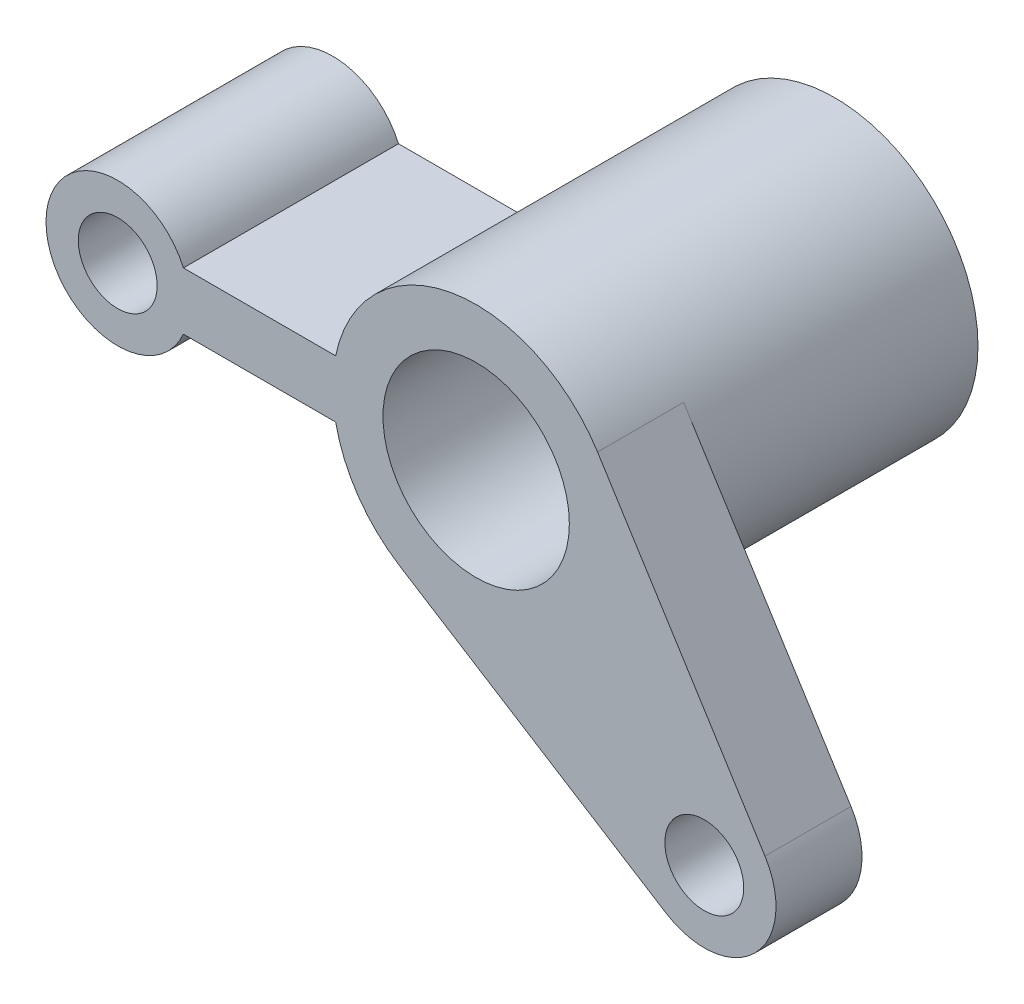
ISO-10303-21;
HEADER;
FILE_DESCRIPTION(('STEP AP214'),'2;1');
FILE_NAME('part.step','',(''),(''),'','','');
FILE_SCHEMA(('AUTOMOTIVE_DESIGN { 1 0 10303 214 1 1 1 1 }'));
ENDSEC;
DATA;
#1=APPLICATION_CONTEXT('core data for automotive mechanical design processes');
#2=APPLICATION_PROTOCOL_DEFINITION('international standard','automotive_design',2000,#1);
#3=PRODUCT_CONTEXT('',#1,'mechanical');
#4=PRODUCT('Part','Part','',(#3));
#5=PRODUCT_RELATED_PRODUCT_CATEGORY('part','',(#4));
#6=PRODUCT_DEFINITION_FORMATION('','',#4);
#7=PRODUCT_DEFINITION_CONTEXT('part definition',#1,'design');
#8=PRODUCT_DEFINITION('design','',#6,#7);
#9=PRODUCT_DEFINITION_SHAPE('','',#8);
#10=(LENGTH_UNIT() NAMED_UNIT(*) SI_UNIT(.MILLI.,.METRE.));
#11=(NAMED_UNIT(*) PLANE_ANGLE_UNIT() SI_UNIT($,.RADIAN.));
#12=(NAMED_UNIT(*) SI_UNIT($,.STERADIAN.) SOLID_ANGLE_UNIT());
#13=UNCERTAINTY_MEASURE_WITH_UNIT(LENGTH_MEASURE(1.E-05),#10,'distance_accuracy_value','');
#14=(GEOMETRIC_REPRESENTATION_CONTEXT(3) GLOBAL_UNCERTAINTY_ASSIGNED_CONTEXT((#13)) GLOBAL_UNIT_ASSIGNED_CONTEXT((#10,
#11,#12)) REPRESENTATION_CONTEXT('',''));
#15=CARTESIAN_POINT('',(0.,0.,0.));
#16=DIRECTION('',(0.,0.,1.));
#17=DIRECTION('',(1.,0.,0.));
#18=AXIS2_PLACEMENT_3D('',#15,#16,#17);
#19=CARTESIAN_POINT('',(0.,0.,50.));
#20=DIRECTION('',(0.,0.,-1.));
#21=DIRECTION('',(-1.,0.,0.));
#22=AXIS2_PLACEMENT_3D('',#19,#20,#21);
#23=CYLINDRICAL_SURFACE('',#22,20.);
#24=CARTESIAN_POINT('',(0.,0.,0.));
#25=DIRECTION('',(0.,0.,1.));
#26=DIRECTION('',(1.,0.,0.));
#27=AXIS2_PLACEMENT_3D('',#24,#25,#26);
#28=CIRCLE('',#27,20.);
#29=CARTESIAN_POINT('',(20.,0.,0.));
#30=VERTEX_POINT('',#29);
#31=EDGE_CURVE('E189',#30,#30,#28,.T.);
#32=ORIENTED_EDGE('',*,*,#31,.T.);
#33=EDGE_LOOP('',(#32));
#34=FACE_BOUND('',#33,.T.);
#35=DIRECTION('',(0.,0.,1.));
#36=VECTOR('',#35,1.);
#37=CARTESIAN_POINT('',(-10.6458294680497,-16.9312230785967,38.));
#38=LINE('',#37,#36);
#39=CARTESIAN_POINT('',(-10.6458294680497,-16.9312230785967,38.));
#40=VERTEX_POINT('',#39);
#41=CARTESIAN_POINT('',(-10.6458294680497,-16.9312230785967,50.));
#42=VERTEX_POINT('',#41);
#43=EDGE_CURVE('E142',#40,#42,#38,.T.);
#44=ORIENTED_EDGE('',*,*,#43,.T.);
#45=CARTESIAN_POINT('',(0.,0.,50.));
#46=DIRECTION('',(0.,0.,1.));
#47=DIRECTION('',(1.,0.,0.));
#48=AXIS2_PLACEMENT_3D('',#45,#46,#47);
#49=CIRCLE('',#48,20.);
#50=CARTESIAN_POINT('',(-19.5959179422654,-4.,50.));
#51=VERTEX_POINT('',#50);
#52=EDGE_CURVE('E69',#51,#42,#49,.T.);
#53=ORIENTED_EDGE('',*,*,#52,.F.);
#54=DIRECTION('',(0.,0.,-1.));
#55=VECTOR('',#54,1.);
#56=CARTESIAN_POINT('',(-19.5959179422654,-4.,50.));
#57=LINE('',#56,#55);
#58=CARTESIAN_POINT('',(-19.5959179422654,-4.,20.));
#59=VERTEX_POINT('',#58);
#60=EDGE_CURVE('E174',#51,#59,#57,.T.);
#61=ORIENTED_EDGE('',*,*,#60,.T.);
#62=CARTESIAN_POINT('',(0.,0.,20.));
#63=DIRECTION('',(0.,0.,1.));
#64=DIRECTION('',(1.,0.,0.));
#65=AXIS2_PLACEMENT_3D('',#62,#63,#64);
#66=CIRCLE('',#65,20.);
#67=CARTESIAN_POINT('',(-19.5959179422654,4.,20.));
#68=VERTEX_POINT('',#67);
#69=EDGE_CURVE('E12',#68,#59,#66,.T.);
#70=ORIENTED_EDGE('',*,*,#69,.F.);
#71=DIRECTION('',(0.,0.,-1.));
#72=VECTOR('',#71,1.);
#73=CARTESIAN_POINT('',(-19.5959179422654,4.,50.));
#74=LINE('',#73,#72);
#75=CARTESIAN_POINT('',(-19.5959179422654,4.,50.));
#76=VERTEX_POINT('',#75);
#77=EDGE_CURVE('E187',#76,#68,#74,.T.);
#78=ORIENTED_EDGE('',*,*,#77,.F.);
#79=CARTESIAN_POINT('',(16.9312230785967,10.6458294680496,50.));
#80=VERTEX_POINT('',#79);
#81=EDGE_CURVE('E192',#80,#76,#49,.T.);
#82=ORIENTED_EDGE('',*,*,#81,.F.);
#83=DIRECTION('',(0.,0.,1.));
#84=VECTOR('',#83,1.);
#85=CARTESIAN_POINT('',(16.9312230785967,10.6458294680496,38.));
#86=LINE('',#85,#84);
#87=CARTESIAN_POINT('',(16.9312230785967,10.6458294680496,38.));
#88=VERTEX_POINT('',#87);
#89=EDGE_CURVE('E162',#88,#80,#86,.T.);
#90=ORIENTED_EDGE('',*,*,#89,.F.);
#91=CARTESIAN_POINT('',(0.,0.,38.));
#92=DIRECTION('',(0.,0.,1.));
#93=DIRECTION('',(1.,0.,0.));
#94=AXIS2_PLACEMENT_3D('',#91,#92,#93);
#95=CIRCLE('',#94,20.);
#96=EDGE_CURVE('E136',#40,#88,#95,.T.);
#97=ORIENTED_EDGE('',*,*,#96,.F.);
#98=EDGE_LOOP('',(#44,#53,#61,#70,#78,#82,#90,#97));
#99=FACE_BOUND('',#98,.T.);
#100=ADVANCED_FACE('F61',(#34,#99),#23,.T.);
#101=CARTESIAN_POINT('',(0.,0.,50.));
#102=DIRECTION('',(0.,0.,1.));
#103=DIRECTION('',(1.,0.,0.));
#104=AXIS2_PLACEMENT_3D('',#101,#102,#103);
#105=PLANE('',#104);
#106=CARTESIAN_POINT('',(31.8198051533946,-31.8198051533947,50.));
#107=DIRECTION('',(0.,0.,1.));
#108=DIRECTION('',(1.,0.,0.));
#109=AXIS2_PLACEMENT_3D('',#106,#107,#108);
#110=CIRCLE('',#109,5.5);
#111=CARTESIAN_POINT('',(37.3198051533946,-31.8198051533947,50.));
#112=VERTEX_POINT('',#111);
#113=EDGE_CURVE('E206',#112,#112,#110,.T.);
#114=ORIENTED_EDGE('',*,*,#113,.F.);
#115=EDGE_LOOP('',(#114));
#116=FACE_BOUND('',#115,.T.);
#117=CARTESIAN_POINT('',(-50.,0.,50.));
#118=DIRECTION('',(0.,0.,1.));
#119=DIRECTION('',(1.,0.,0.));
#120=AXIS2_PLACEMENT_3D('',#117,#118,#119);
#121=CIRCLE('',#120,5.5);
#122=CARTESIAN_POINT('',(-44.5,0.,50.));
#123=VERTEX_POINT('',#122);
#124=EDGE_CURVE('E197',#123,#123,#121,.T.);
#125=ORIENTED_EDGE('',*,*,#124,.F.);
#126=EDGE_LOOP('',(#125));
#127=FACE_BOUND('',#126,.T.);
#128=CARTESIAN_POINT('',(0.,0.,50.));
#129=DIRECTION('',(0.,0.,1.));
#130=DIRECTION('',(1.,0.,0.));
#131=AXIS2_PLACEMENT_3D('',#128,#129,#130);
#132=CIRCLE('',#131,13.);
#133=CARTESIAN_POINT('',(13.,0.,50.));
#134=VERTEX_POINT('',#133);
#135=EDGE_CURVE('E196',#134,#134,#132,.T.);
#136=ORIENTED_EDGE('',*,*,#135,.F.);
#137=EDGE_LOOP('',(#136));
#138=FACE_BOUND('',#137,.T.);
#139=ORIENTED_EDGE('',*,*,#52,.T.);
#140=DIRECTION('',(-0.846561153929835,0.532291473402483,0.));
#141=VECTOR('',#140,1.);
#142=CARTESIAN_POINT('',(-10.6458294680497,-16.9312230785967,50.));
#143=LINE('',#142,#141);
#144=CARTESIAN_POINT('',(26.4968904193698,-40.285416692693,50.));
#145=VERTEX_POINT('',#144);
#146=EDGE_CURVE('E155',#145,#42,#143,.T.);
#147=ORIENTED_EDGE('',*,*,#146,.F.);
#148=CARTESIAN_POINT('',(31.8198051533946,-31.8198051533947,50.));
#149=DIRECTION('',(0.,0.,1.));
#150=DIRECTION('',(1.,0.,0.));
#151=AXIS2_PLACEMENT_3D('',#148,#149,#150);
#152=CIRCLE('',#151,10.);
#153=CARTESIAN_POINT('',(40.2854166926929,-26.4968904193699,50.));
#154=VERTEX_POINT('',#153);
#155=EDGE_CURVE('E132',#145,#154,#152,.T.);
#156=ORIENTED_EDGE('',*,*,#155,.T.);
#157=DIRECTION('',(-0.53229147340248,0.846561153929837,0.));
#158=VECTOR('',#157,1.);
#159=CARTESIAN_POINT('',(16.9312230785967,10.6458294680496,50.));
#160=LINE('',#159,#158);
#161=EDGE_CURVE('E77',#154,#80,#160,.T.);
#162=ORIENTED_EDGE('',*,*,#161,.T.);
#163=ORIENTED_EDGE('',*,*,#81,.T.);
#164=DIRECTION('',(1.,0.,0.));
#165=VECTOR('',#164,1.);
#166=CARTESIAN_POINT('',(-50.,3.99999999999999,50.));
#167=LINE('',#166,#165);
#168=CARTESIAN_POINT('',(-40.8348486100883,3.99999999999999,50.));
#169=VERTEX_POINT('',#168);
#170=EDGE_CURVE('E161',#169,#76,#167,.T.);
#171=ORIENTED_EDGE('',*,*,#170,.F.);
#172=CARTESIAN_POINT('',(-50.,0.,50.));
#173=DIRECTION('',(0.,0.,1.));
#174=DIRECTION('',(1.,0.,0.));
#175=AXIS2_PLACEMENT_3D('',#172,#173,#174);
#176=CIRCLE('',#175,10.);
#177=CARTESIAN_POINT('',(-40.8348486100883,-4.,50.));
#178=VERTEX_POINT('',#177);
#179=EDGE_CURVE('E169',#169,#178,#176,.T.);
#180=ORIENTED_EDGE('',*,*,#179,.T.);
#181=DIRECTION('',(1.,0.,0.));
#182=VECTOR('',#181,1.);
#183=CARTESIAN_POINT('',(-50.,-4.,50.));
#184=LINE('',#183,#182);
#185=EDGE_CURVE('E179',#178,#51,#184,.T.);
#186=ORIENTED_EDGE('',*,*,#185,.T.);
#187=EDGE_LOOP('',(#139,#147,#156,#162,#163,#171,#180,#186));
#188=FACE_BOUND('',#187,.T.);
#189=ADVANCED_FACE('F222',(#116,#127,#138,#188),#105,.T.);
#190=CARTESIAN_POINT('',(0.,0.,0.));
#191=DIRECTION('',(0.,0.,1.));
#192=DIRECTION('',(1.,0.,0.));
#193=AXIS2_PLACEMENT_3D('',#190,#191,#192);
#194=PLANE('',#193);
#195=CARTESIAN_POINT('',(0.,0.,0.));
#196=DIRECTION('',(0.,0.,1.));
#197=DIRECTION('',(1.,0.,0.));
#198=AXIS2_PLACEMENT_3D('',#195,#196,#197);
#199=CIRCLE('',#198,13.);
#200=CARTESIAN_POINT('',(13.,0.,0.));
#201=VERTEX_POINT('',#200);
#202=EDGE_CURVE('E157',#201,#201,#199,.T.);
#203=ORIENTED_EDGE('',*,*,#202,.T.);
#204=EDGE_LOOP('',(#203));
#205=FACE_BOUND('',#204,.T.);
#206=ORIENTED_EDGE('',*,*,#31,.F.);
#207=EDGE_LOOP('',(#206));
#208=FACE_BOUND('',#207,.T.);
#209=ADVANCED_FACE('F212',(#205,#208),#194,.F.);
#210=CARTESIAN_POINT('',(0.,0.,20.));
#211=DIRECTION('',(0.,0.,1.));
#212=DIRECTION('',(1.,0.,0.));
#213=AXIS2_PLACEMENT_3D('',#210,#211,#212);
#214=PLANE('',#213);
#215=CARTESIAN_POINT('',(-50.,0.,20.));
#216=DIRECTION('',(0.,0.,1.));
#217=DIRECTION('',(1.,0.,0.));
#218=AXIS2_PLACEMENT_3D('',#215,#216,#217);
#219=CIRCLE('',#218,5.5);
#220=CARTESIAN_POINT('',(-44.5,0.,20.));
#221=VERTEX_POINT('',#220);
#222=EDGE_CURVE('E194',#221,#221,#219,.T.);
#223=ORIENTED_EDGE('',*,*,#222,.T.);
#224=EDGE_LOOP('',(#223));
#225=FACE_BOUND('',#224,.T.);
#226=DIRECTION('',(1.,0.,0.));
#227=VECTOR('',#226,1.);
#228=CARTESIAN_POINT('',(-50.,3.99999999999999,20.));
#229=LINE('',#228,#227);
#230=CARTESIAN_POINT('',(-40.8348486100883,3.99999999999999,20.));
#231=VERTEX_POINT('',#230);
#232=EDGE_CURVE('E176',#231,#68,#229,.T.);
#233=ORIENTED_EDGE('',*,*,#232,.T.);
#234=ORIENTED_EDGE('',*,*,#69,.T.);
#235=DIRECTION('',(1.,0.,0.));
#236=VECTOR('',#235,1.);
#237=CARTESIAN_POINT('',(-50.,-4.,20.));
#238=LINE('',#237,#236);
#239=CARTESIAN_POINT('',(-40.8348486100883,-4.,20.));
#240=VERTEX_POINT('',#239);
#241=EDGE_CURVE('E85',#240,#59,#238,.T.);
#242=ORIENTED_EDGE('',*,*,#241,.F.);
#243=CARTESIAN_POINT('',(-50.,0.,20.));
#244=DIRECTION('',(0.,0.,1.));
#245=DIRECTION('',(1.,0.,0.));
#246=AXIS2_PLACEMENT_3D('',#243,#244,#245);
#247=CIRCLE('',#246,10.);
#248=EDGE_CURVE('E165',#231,#240,#247,.T.);
#249=ORIENTED_EDGE('',*,*,#248,.F.);
#250=EDGE_LOOP('',(#233,#234,#242,#249));
#251=FACE_BOUND('',#250,.T.);
#252=ADVANCED_FACE('F251',(#225,#251),#214,.F.);
#253=CARTESIAN_POINT('',(-50.,3.99999999999999,20.));
#254=DIRECTION('',(0.,-1.,0.));
#255=DIRECTION('',(1.,0.,0.));
#256=AXIS2_PLACEMENT_3D('',#253,#254,#255);
#257=PLANE('',#256);
#258=ORIENTED_EDGE('',*,*,#170,.T.);
#259=ORIENTED_EDGE('',*,*,#77,.T.);
#260=ORIENTED_EDGE('',*,*,#232,.F.);
#261=DIRECTION('',(0.,0.,1.));
#262=VECTOR('',#261,1.);
#263=CARTESIAN_POINT('',(-40.8348486100883,3.99999999999999,20.));
#264=LINE('',#263,#262);
#265=EDGE_CURVE('E168',#231,#169,#264,.T.);
#266=ORIENTED_EDGE('',*,*,#265,.T.);
#267=EDGE_LOOP('',(#258,#259,#260,#266));
#268=FACE_BOUND('',#267,.T.);
#269=ADVANCED_FACE('F238',(#268),#257,.F.);
#270=CARTESIAN_POINT('',(-50.,-4.,20.));
#271=DIRECTION('',(0.,-1.,0.));
#272=DIRECTION('',(0.,0.,-1.));
#273=AXIS2_PLACEMENT_3D('',#270,#271,#272);
#274=PLANE('',#273);
#275=ORIENTED_EDGE('',*,*,#60,.F.);
#276=ORIENTED_EDGE('',*,*,#185,.F.);
#277=DIRECTION('',(0.,0.,1.));
#278=VECTOR('',#277,1.);
#279=CARTESIAN_POINT('',(-40.8348486100883,-4.,20.));
#280=LINE('',#279,#278);
#281=EDGE_CURVE('E172',#240,#178,#280,.T.);
#282=ORIENTED_EDGE('',*,*,#281,.F.);
#283=ORIENTED_EDGE('',*,*,#241,.T.);
#284=EDGE_LOOP('',(#275,#276,#282,#283));
#285=FACE_BOUND('',#284,.T.);
#286=ADVANCED_FACE('F243',(#285),#274,.T.);
#287=CARTESIAN_POINT('',(-50.,0.,20.));
#288=DIRECTION('',(0.,0.,1.));
#289=DIRECTION('',(1.,0.,0.));
#290=AXIS2_PLACEMENT_3D('',#287,#288,#289);
#291=CYLINDRICAL_SURFACE('',#290,10.);
#292=ORIENTED_EDGE('',*,*,#179,.F.);
#293=ORIENTED_EDGE('',*,*,#265,.F.);
#294=ORIENTED_EDGE('',*,*,#248,.T.);
#295=ORIENTED_EDGE('',*,*,#281,.T.);
#296=EDGE_LOOP('',(#292,#293,#294,#295));
#297=FACE_BOUND('',#296,.T.);
#298=ADVANCED_FACE('F242',(#297),#291,.T.);
#299=CARTESIAN_POINT('',(-10.6458294680497,-16.9312230785967,38.));
#300=DIRECTION('',(0.532291473402483,0.846561153929835,0.));
#301=DIRECTION('',(-0.846561153929835,0.532291473402483,0.));
#302=AXIS2_PLACEMENT_3D('',#299,#300,#301);
#303=PLANE('',#302);
#304=ORIENTED_EDGE('',*,*,#146,.T.);
#305=ORIENTED_EDGE('',*,*,#43,.F.);
#306=DIRECTION('',(-0.846561153929835,0.532291473402483,0.));
#307=VECTOR('',#306,1.);
#308=CARTESIAN_POINT('',(-10.6458294680497,-16.9312230785967,38.));
#309=LINE('',#308,#307);
#310=CARTESIAN_POINT('',(26.4968904193698,-40.285416692693,38.));
#311=VERTEX_POINT('',#310);
#312=EDGE_CURVE('E139',#311,#40,#309,.T.);
#313=ORIENTED_EDGE('',*,*,#312,.F.);
#314=DIRECTION('',(0.,0.,1.));
#315=VECTOR('',#314,1.);
#316=CARTESIAN_POINT('',(26.4968904193698,-40.285416692693,38.));
#317=LINE('',#316,#315);
#318=EDGE_CURVE('E127',#311,#145,#317,.T.);
#319=ORIENTED_EDGE('',*,*,#318,.T.);
#320=EDGE_LOOP('',(#304,#305,#313,#319));
#321=FACE_BOUND('',#320,.T.);
#322=ADVANCED_FACE('F140',(#321),#303,.F.);
#323=CARTESIAN_POINT('',(16.9312230785967,10.6458294680496,38.));
#324=DIRECTION('',(0.846561153929837,0.53229147340248,0.));
#325=DIRECTION('',(-0.53229147340248,0.846561153929837,0.));
#326=AXIS2_PLACEMENT_3D('',#323,#324,#325);
#327=PLANE('',#326);
#328=ORIENTED_EDGE('',*,*,#161,.F.);
#329=DIRECTION('',(0.,0.,1.));
#330=VECTOR('',#329,1.);
#331=CARTESIAN_POINT('',(40.2854166926929,-26.4968904193699,38.));
#332=LINE('',#331,#330);
#333=CARTESIAN_POINT('',(40.2854166926929,-26.4968904193699,38.));
#334=VERTEX_POINT('',#333);
#335=EDGE_CURVE('E135',#334,#154,#332,.T.);
#336=ORIENTED_EDGE('',*,*,#335,.F.);
#337=DIRECTION('',(-0.53229147340248,0.846561153929837,0.));
#338=VECTOR('',#337,1.);
#339=CARTESIAN_POINT('',(16.9312230785967,10.6458294680496,38.));
#340=LINE('',#339,#338);
#341=EDGE_CURVE('E149',#334,#88,#340,.T.);
#342=ORIENTED_EDGE('',*,*,#341,.T.);
#343=ORIENTED_EDGE('',*,*,#89,.T.);
#344=EDGE_LOOP('',(#328,#336,#342,#343));
#345=FACE_BOUND('',#344,.T.);
#346=ADVANCED_FACE('F233',(#345),#327,.T.);
#347=CARTESIAN_POINT('',(31.8198051533946,-31.8198051533947,38.));
#348=DIRECTION('',(0.,0.,1.));
#349=DIRECTION('',(1.,0.,0.));
#350=AXIS2_PLACEMENT_3D('',#347,#348,#349);
#351=CYLINDRICAL_SURFACE('',#350,10.);
#352=ORIENTED_EDGE('',*,*,#155,.F.);
#353=ORIENTED_EDGE('',*,*,#318,.F.);
#354=CARTESIAN_POINT('',(31.8198051533946,-31.8198051533947,38.));
#355=DIRECTION('',(0.,0.,1.));
#356=DIRECTION('',(1.,0.,0.));
#357=AXIS2_PLACEMENT_3D('',#354,#355,#356);
#358=CIRCLE('',#357,10.);
#359=EDGE_CURVE('E131',#311,#334,#358,.T.);
#360=ORIENTED_EDGE('',*,*,#359,.T.);
#361=ORIENTED_EDGE('',*,*,#335,.T.);
#362=EDGE_LOOP('',(#352,#353,#360,#361));
#363=FACE_BOUND('',#362,.T.);
#364=ADVANCED_FACE('F129',(#363),#351,.T.);
#365=CARTESIAN_POINT('',(0.,0.,38.));
#366=DIRECTION('',(0.,0.,1.));
#367=DIRECTION('',(1.,0.,0.));
#368=AXIS2_PLACEMENT_3D('',#365,#366,#367);
#369=PLANE('',#368);
#370=CARTESIAN_POINT('',(31.8198051533946,-31.8198051533947,38.));
#371=DIRECTION('',(0.,0.,1.));
#372=DIRECTION('',(1.,0.,0.));
#373=AXIS2_PLACEMENT_3D('',#370,#371,#372);
#374=CIRCLE('',#373,5.5);
#375=CARTESIAN_POINT('',(37.3198051533946,-31.8198051533947,38.));
#376=VERTEX_POINT('',#375);
#377=EDGE_CURVE('E64',#376,#376,#374,.T.);
#378=ORIENTED_EDGE('',*,*,#377,.T.);
#379=EDGE_LOOP('',(#378));
#380=FACE_BOUND('',#379,.T.);
#381=ORIENTED_EDGE('',*,*,#312,.T.);
#382=ORIENTED_EDGE('',*,*,#96,.T.);
#383=ORIENTED_EDGE('',*,*,#341,.F.);
#384=ORIENTED_EDGE('',*,*,#359,.F.);
#385=EDGE_LOOP('',(#381,#382,#383,#384));
#386=FACE_BOUND('',#385,.T.);
#387=ADVANCED_FACE('F147',(#380,#386),#369,.F.);
#388=CARTESIAN_POINT('',(0.,0.,0.));
#389=DIRECTION('',(0.,0.,1.));
#390=DIRECTION('',(1.,0.,0.));
#391=AXIS2_PLACEMENT_3D('',#388,#389,#390);
#392=CYLINDRICAL_SURFACE('',#391,13.);
#393=ORIENTED_EDGE('',*,*,#202,.F.);
#394=EDGE_LOOP('',(#393));
#395=FACE_BOUND('',#394,.T.);
#396=ORIENTED_EDGE('',*,*,#135,.T.);
#397=EDGE_LOOP('',(#396));
#398=FACE_BOUND('',#397,.T.);
#399=ADVANCED_FACE('F215',(#395,#398),#392,.F.);
#400=CARTESIAN_POINT('',(-50.,0.,0.));
#401=DIRECTION('',(0.,0.,1.));
#402=DIRECTION('',(1.,0.,0.));
#403=AXIS2_PLACEMENT_3D('',#400,#401,#402);
#404=CYLINDRICAL_SURFACE('',#403,5.5);
#405=ORIENTED_EDGE('',*,*,#124,.T.);
#406=EDGE_LOOP('',(#405));
#407=FACE_BOUND('',#406,.T.);
#408=ORIENTED_EDGE('',*,*,#222,.F.);
#409=EDGE_LOOP('',(#408));
#410=FACE_BOUND('',#409,.T.);
#411=ADVANCED_FACE('F218',(#407,#410),#404,.F.);
#412=CARTESIAN_POINT('',(31.8198051533946,-31.8198051533947,0.));
#413=DIRECTION('',(0.,0.,1.));
#414=DIRECTION('',(1.,0.,0.));
#415=AXIS2_PLACEMENT_3D('',#412,#413,#414);
#416=CYLINDRICAL_SURFACE('',#415,5.5);
#417=ORIENTED_EDGE('',*,*,#113,.T.);
#418=EDGE_LOOP('',(#417));
#419=FACE_BOUND('',#418,.T.);
#420=ORIENTED_EDGE('',*,*,#377,.F.);
#421=EDGE_LOOP('',(#420));
#422=FACE_BOUND('',#421,.T.);
#423=ADVANCED_FACE('F278',(#419,#422),#416,.F.);
#424=CLOSED_SHELL('',(#100,#189,#209,#252,#269,#286,#298,#322,#346,#364,#387,#399,#411,#423));
#425=MANIFOLD_SOLID_BREP('B2',#424);
#426=ADVANCED_BREP_SHAPE_REPRESENTATION('',(#18,#425),#14);
#427=SHAPE_DEFINITION_REPRESENTATION(#9,#426);
ENDSEC;
END-ISO-10303-21;
